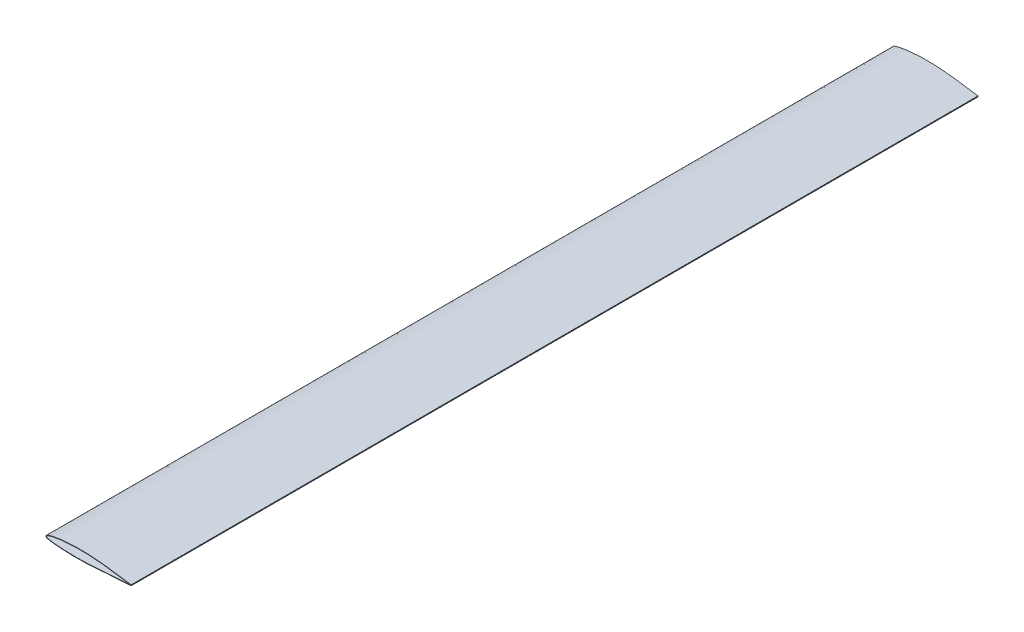
ISO-10303-21;
HEADER;
FILE_DESCRIPTION(('STEP AP214'),'2;1');
FILE_NAME('part.step','',(''),(''),'','','');
FILE_SCHEMA(('AUTOMOTIVE_DESIGN { 1 0 10303 214 1 1 1 1 }'));
ENDSEC;
DATA;
#1=APPLICATION_CONTEXT('core data for automotive mechanical design processes');
#2=APPLICATION_PROTOCOL_DEFINITION('international standard','automotive_design',2000,#1);
#3=PRODUCT_CONTEXT('',#1,'mechanical');
#4=PRODUCT('Part','Part','',(#3));
#5=PRODUCT_RELATED_PRODUCT_CATEGORY('part','',(#4));
#6=PRODUCT_DEFINITION_FORMATION('','',#4);
#7=PRODUCT_DEFINITION_CONTEXT('part definition',#1,'design');
#8=PRODUCT_DEFINITION('design','',#6,#7);
#9=PRODUCT_DEFINITION_SHAPE('','',#8);
#10=(LENGTH_UNIT() NAMED_UNIT(*) SI_UNIT(.MILLI.,.METRE.));
#11=(NAMED_UNIT(*) PLANE_ANGLE_UNIT() SI_UNIT($,.RADIAN.));
#12=(NAMED_UNIT(*) SI_UNIT($,.STERADIAN.) SOLID_ANGLE_UNIT());
#13=UNCERTAINTY_MEASURE_WITH_UNIT(LENGTH_MEASURE(1.E-05),#10,'distance_accuracy_value','');
#14=(GEOMETRIC_REPRESENTATION_CONTEXT(3) GLOBAL_UNCERTAINTY_ASSIGNED_CONTEXT((#13)) GLOBAL_UNIT_ASSIGNED_CONTEXT((#10,
#11,#12)) REPRESENTATION_CONTEXT('',''));
#15=CARTESIAN_POINT('',(0.,0.,0.));
#16=DIRECTION('',(0.,0.,1.));
#17=DIRECTION('',(1.,0.,0.));
#18=AXIS2_PLACEMENT_3D('',#15,#16,#17);
#19=CARTESIAN_POINT('',(2001.51532610475,10.3045225881818,20000.));
#20=CARTESIAN_POINT('',(1980.68493953394,13.4978815249531,20000.));
#21=CARTESIAN_POINT('',(1949.44122769335,18.2876339191739,20000.));
#22=CARTESIAN_POINT('',(1918.20299921555,23.0946734630963,20000.));
#23=CARTESIAN_POINT('',(1897.37902990891,26.3051758829924,20000.));
#24=CARTESIAN_POINT('',(1886.9673263735,27.914015753059,20000.));
#25=CARTESIAN_POINT('',(1855.72733629627,32.7415564034172,20000.));
#26=CARTESIAN_POINT('',(1834.8957304358,35.9604925125355,20000.));
#27=CARTESIAN_POINT('',(1803.63385341161,40.742985964666,20000.));
#28=CARTESIAN_POINT('',(1793.21049611926,42.3284162430746,20000.));
#29=CARTESIAN_POINT('',(1772.36531272727,45.4834240329847,20000.));
#30=CARTESIAN_POINT('',(1751.52028583215,48.6241055351189,20000.));
#31=CARTESIAN_POINT('',(1730.67767334457,51.7506037528209,20000.));
#32=CARTESIAN_POINT('',(1709.83731798834,54.8772402324528,20000.));
#33=CARTESIAN_POINT('',(1699.41983613792,56.4420174827869,20000.));
#34=CARTESIAN_POINT('',(1668.15421968129,61.1364281267247,20000.));
#35=CARTESIAN_POINT('',(1647.29523240685,64.257769053587,20000.));
#36=CARTESIAN_POINT('',(1615.96565889917,68.7974754762002,20000.));
#37=CARTESIAN_POINT('',(1605.51384785611,70.286430270677,20000.));
#38=CARTESIAN_POINT('',(1584.60263187074,73.1976590695309,20000.));
#39=CARTESIAN_POINT('',(1574.14455728518,74.622160008265,20000.));
#40=CARTESIAN_POINT('',(1542.76569437496,78.8201789321044,20000.));
#41=CARTESIAN_POINT('',(1521.84083490686,81.5181942833369,20000.));
#42=CARTESIAN_POINT('',(1479.99112654353,86.8081332180795,20000.));
#43=CARTESIAN_POINT('',(1459.05573467833,89.3996018331019,20000.));
#44=CARTESIAN_POINT('',(1417.15842822003,94.4256851934779,20000.));
#45=CARTESIAN_POINT('',(1396.19478286264,96.8575758760806,20000.));
#46=CARTESIAN_POINT('',(1354.24783687956,101.529266739438,20000.));
#47=CARTESIAN_POINT('',(1333.26437145706,103.772971351125,20000.));
#48=CARTESIAN_POINT('',(1291.27979946758,108.080875931212,20000.));
#49=CARTESIAN_POINT('',(1270.27802048529,110.146585463907,20000.));
#50=CARTESIAN_POINT('',(1207.23933269545,116.05222747816,20000.));
#51=CARTESIAN_POINT('',(1165.17006510799,119.597491474263,20000.));
#52=CARTESIAN_POINT('',(1080.95279123056,125.761490407663,20000.));
#53=CARTESIAN_POINT('',(1038.80377219544,128.385515816948,20000.));
#54=CARTESIAN_POINT('',(975.525018029598,131.487315279104,20000.));
#55=CARTESIAN_POINT('',(954.422452432324,132.381749304307,20000.));
#56=CARTESIAN_POINT('',(912.200621784031,133.856847350967,20000.));
#57=CARTESIAN_POINT('',(891.081648432541,134.438942769075,20000.));
#58=CARTESIAN_POINT('',(848.826316253626,135.246338933748,20000.));
#59=CARTESIAN_POINT('',(827.690647929279,135.470002685622,20000.));
#60=CARTESIAN_POINT('',(785.410062144907,135.497724592581,20000.));
#61=CARTESIAN_POINT('',(764.27100972784,135.295831912138,20000.));
#62=CARTESIAN_POINT('',(722.013893782876,134.526052749033,20000.));
#63=CARTESIAN_POINT('',(700.895703122682,133.961152156519,20000.));
#64=CARTESIAN_POINT('',(658.671757587298,132.526667465867,20000.));
#65=CARTESIAN_POINT('',(637.565428377157,131.651926090623,20000.));
#66=CARTESIAN_POINT('',(574.269602292305,128.555478389686,20000.));
#67=CARTESIAN_POINT('',(532.103125523991,125.865025293977,20000.));
#68=CARTESIAN_POINT('',(468.921115795082,120.849722133069,20000.));
#69=CARTESIAN_POINT('',(447.869685996185,119.012320259405,20000.));
#70=CARTESIAN_POINT('',(405.796218836086,114.959272836863,20000.));
#71=CARTESIAN_POINT('',(384.77394639266,112.742664261642,20000.));
#72=CARTESIAN_POINT('',(342.772461280857,107.89026477866,20000.));
#73=CARTESIAN_POINT('',(321.792929524549,105.255300049071,20000.));
#74=CARTESIAN_POINT('',(279.886976792312,99.5351760470048,20000.));
#75=CARTESIAN_POINT('',(258.950431691582,96.4538515632745,20000.));
#76=CARTESIAN_POINT('',(217.148071042828,89.660347140306,20000.));
#77=CARTESIAN_POINT('',(196.282431941437,85.9466102667113,20000.));
#78=CARTESIAN_POINT('',(165.082975035765,79.765138053068,20000.));
#79=CARTESIAN_POINT('',(154.70086178295,77.603689499628,20000.));
#80=CARTESIAN_POINT('',(133.976443729371,73.0581857745765,20000.));
#81=CARTESIAN_POINT('',(123.62206808447,70.6702478509275,20000.));
#82=CARTESIAN_POINT('',(108.123245531903,66.8332588201902,20000.));
#83=CARTESIAN_POINT('',(102.962432796152,65.511741043564,20000.));
#84=CARTESIAN_POINT('',(92.6553035835602,62.7698609309555,20000.));
#85=CARTESIAN_POINT('',(87.5058154219349,61.3501425468367,20000.));
#86=CARTESIAN_POINT('',(72.0738595945467,56.8909798073648,20000.));
#87=CARTESIAN_POINT('',(61.8157997522479,53.6525191991726,20000.));
#88=CARTESIAN_POINT('',(49.1155669486103,49.0974950167608,20000.));
#89=CARTESIAN_POINT('',(46.5821089669436,48.1613049951805,20000.));
#90=CARTESIAN_POINT('',(41.5278265434441,46.2330627590797,20000.));
#91=CARTESIAN_POINT('',(38.9936722060659,45.2357617041857,20000.));
#92=CARTESIAN_POINT('',(31.3907806220379,42.1012982481726,20000.));
#93=CARTESIAN_POINT('',(26.3208204358396,39.8218030851894,20000.));
#94=CARTESIAN_POINT('',(20.0586818754113,36.5858778268073,20000.));
#95=CARTESIAN_POINT('',(18.8107114337705,35.9197416288892,20000.));
#96=CARTESIAN_POINT('',(16.3215794430235,34.5431436651247,20000.));
#97=CARTESIAN_POINT('',(15.0799020722828,33.8322060029232,20000.));
#98=CARTESIAN_POINT('',(12.6115738188255,32.3614071157317,20000.));
#99=CARTESIAN_POINT('',(11.3849183766263,31.6015492416052,20000.));
#100=CARTESIAN_POINT('',(9.56317002484203,30.4219067056616,20000.));
#101=CARTESIAN_POINT('',(8.95896046780812,30.0220450687929,20000.));
#102=CARTESIAN_POINT('',(8.058090480664,29.4118388167201,20000.));
#103=CARTESIAN_POINT('',(7.75994869093506,29.2075813208918,20000.));
#104=CARTESIAN_POINT('',(7.15977646376483,28.7913693456616,20000.));
#105=CARTESIAN_POINT('',(6.85588197075561,28.5780220081686,20000.));
#106=CARTESIAN_POINT('',(5.31890891762688,27.4807605219888,20000.));
#107=CARTESIAN_POINT('',(4.03098832242353,26.5040143109438,20000.));
#108=CARTESIAN_POINT('',(2.07135491146526,24.8183722975245,20000.));
#109=CARTESIAN_POINT('',(1.41141671894823,24.2165665096561,20000.));
#110=CARTESIAN_POINT('',(0.124513508041677,22.9640341344804,20000.));
#111=CARTESIAN_POINT('',(-0.50619603103645,22.3110980723185,20000.));
#112=CARTESIAN_POINT('',(-2.35223929469443,20.2727010749271,20000.));
#113=CARTESIAN_POINT('',(-3.5223848011734,18.808418605997,20000.));
#114=CARTESIAN_POINT('',(-5.67797943523934,15.6571167122524,20000.));
#115=CARTESIAN_POINT('',(-6.66444605897573,13.9702056500003,20000.));
#116=CARTESIAN_POINT('',(-7.92792437936347,11.2439238699316,20000.));
#117=CARTESIAN_POINT('',(-8.31263485169437,10.3022415410215,20000.));
#118=CARTESIAN_POINT('',(-8.98822009238381,8.3470231664018,20000.));
#119=CARTESIAN_POINT('',(-9.27915368062427,7.33331611183203,20000.));
#120=CARTESIAN_POINT('',(-9.73848072132057,5.23084139649043,20000.));
#121=CARTESIAN_POINT('',(-9.90681372382366,4.14178040274182,20000.));
#122=CARTESIAN_POINT('',(-10.0838579520322,1.89529575440687,20000.));
#123=CARTESIAN_POINT('',(-10.09223518977,0.737579707889871,20000.));
#124=CARTESIAN_POINT('',(-9.97787198438215,-0.73597280509779,20000.));
#125=CARTESIAN_POINT('',(-9.94861057223567,-1.03306949895871,20000.));
#126=CARTESIAN_POINT('',(-9.87793573906888,-1.6228606227075,20000.));
#127=CARTESIAN_POINT('',(-9.83664130487994,-1.91527179516748,20000.));
#128=CARTESIAN_POINT('',(-9.69592410376717,-2.78432868510665,20000.));
#129=CARTESIAN_POINT('',(-9.57966860919077,-3.35274833861247,20000.));
#130=CARTESIAN_POINT('',(-9.17209873168616,-5.02122131834309,20000.));
#131=CARTESIAN_POINT('',(-8.82227586196151,-6.08395694818749,20000.));
#132=CARTESIAN_POINT('',(-8.00846306936775,-8.10553667414571,20000.));
#133=CARTESIAN_POINT('',(-7.54455642163185,-9.06473784592262,20000.));
#134=CARTESIAN_POINT('',(-6.5349515451829,-10.887582896722,20000.));
#135=CARTESIAN_POINT('',(-5.98917445338665,-11.7514439360103,20000.));
#136=CARTESIAN_POINT('',(-4.26291679855344,-14.2172113877868,20000.));
#137=CARTESIAN_POINT('',(-2.99519331074599,-15.6948045369837,20000.));
#138=CARTESIAN_POINT('',(-0.336884752614994,-18.3915784327982,20000.));
#139=CARTESIAN_POINT('',(1.0550928124892,-19.6105513288497,20000.));
#140=CARTESIAN_POINT('',(3.18368300533729,-21.2726467376236,20000.));
#141=CARTESIAN_POINT('',(3.90015529314124,-21.7986893443778,20000.));
#142=CARTESIAN_POINT('',(5.33981284935606,-22.7969503592895,20000.));
#143=CARTESIAN_POINT('',(6.06573147513913,-23.2706356577417,20000.));
#144=CARTESIAN_POINT('',(8.22157632872363,-24.5998112411294,20000.));
#145=CARTESIAN_POINT('',(9.62526522163624,-25.3628164967529,20000.));
#146=CARTESIAN_POINT('',(11.3111971737697,-26.2156197257257,20000.));
#147=CARTESIAN_POINT('',(11.6450576162079,-26.3811921541468,20000.));
#148=CARTESIAN_POINT('',(12.3059420580181,-26.7038622972426,20000.));
#149=CARTESIAN_POINT('',(12.6326193842898,-26.8608849955386,20000.));
#150=CARTESIAN_POINT('',(13.617955640403,-27.3280106418199,20000.));
#151=CARTESIAN_POINT('',(14.2767557413562,-27.6314472132707,20000.));
#152=CARTESIAN_POINT('',(16.2570018219769,-28.5195977032063,20000.));
#153=CARTESIAN_POINT('',(17.5822944382137,-29.0821819740311,20000.));
#154=CARTESIAN_POINT('',(20.2331960792433,-30.1570625083207,20000.));
#155=CARTESIAN_POINT('',(21.5588131140164,-30.6693536071775,20000.));
#156=CARTESIAN_POINT('',(24.2003230816388,-31.6514990383317,20000.));
#157=CARTESIAN_POINT('',(25.5187397783914,-32.1226506903293,20000.));
#158=CARTESIAN_POINT('',(32.1208148152877,-34.3978125776941,20000.));
#159=CARTESIAN_POINT('',(37.4098213158365,-35.9503897969538,20000.));
#160=CARTESIAN_POINT('',(45.304077802702,-38.0433269305494,20000.));
#161=CARTESIAN_POINT('',(47.9272200026346,-38.7012018181776,20000.));
#162=CARTESIAN_POINT('',(53.1614162943925,-39.9663294534609,20000.));
#163=CARTESIAN_POINT('',(55.7815107251759,-40.5749499509534,20000.));
#164=CARTESIAN_POINT('',(63.6484861282753,-42.3359075804973,20000.));
#165=CARTESIAN_POINT('',(68.9020497692088,-43.4233546860677,20000.));
#166=CARTESIAN_POINT('',(79.4150531260712,-45.4618321456735,20000.));
#167=CARTESIAN_POINT('',(84.6744987685123,-46.4128636622965,20000.));
#168=CARTESIAN_POINT('',(95.1875597002779,-48.2146911584615,20000.));
#169=CARTESIAN_POINT('',(100.438117868675,-49.065867052824,20000.));
#170=CARTESIAN_POINT('',(116.189150385686,-51.5203444109326,20000.));
#171=CARTESIAN_POINT('',(126.694304539762,-53.0173427121477,20000.));
#172=CARTESIAN_POINT('',(147.705794144928,-55.8113919993721,20000.));
#173=CARTESIAN_POINT('',(158.210310951106,-57.1121737890731,20000.));
#174=CARTESIAN_POINT('',(189.750107715011,-60.7980816064959,20000.));
#175=CARTESIAN_POINT('',(210.799649552929,-62.9530566393929,20000.));
#176=CARTESIAN_POINT('',(252.913014447896,-66.8152167596864,20000.));
#177=CARTESIAN_POINT('',(273.978392024617,-68.5217791111319,20000.));
#178=CARTESIAN_POINT('',(316.106614567756,-71.636971230092,20000.));
#179=CARTESIAN_POINT('',(337.175452839567,-73.0520259097315,20000.));
#180=CARTESIAN_POINT('',(379.331211043362,-75.6134053988037,20000.));
#181=CARTESIAN_POINT('',(400.41697791997,-76.7579959399292,20000.));
#182=CARTESIAN_POINT('',(442.595082859352,-78.7919908035613,20000.));
#183=CARTESIAN_POINT('',(463.687261014038,-79.6834097938268,20000.));
#184=CARTESIAN_POINT('',(505.873534296069,-81.2533896301831,20000.));
#185=CARTESIAN_POINT('',(526.96796293006,-81.9351646331023,20000.));
#186=CARTESIAN_POINT('',(569.165415178501,-83.0940741336446,20000.));
#187=CARTESIAN_POINT('',(590.267594236587,-83.5698940632231,20000.));
#188=CARTESIAN_POINT('',(632.475658602395,-84.3086651424921,20000.));
#189=CARTESIAN_POINT('',(653.581146205809,-84.5722402737262,20000.));
#190=CARTESIAN_POINT('',(685.240249212031,-84.8126600546646,20000.));
#191=CARTESIAN_POINT('',(695.793040165368,-84.8670851767496,20000.));
#192=CARTESIAN_POINT('',(716.900496014951,-84.924439081966,20000.));
#193=CARTESIAN_POINT('',(727.455844607978,-84.9267932778174,20000.));
#194=CARTESIAN_POINT('',(759.126005797906,-84.8405110313745,20000.));
#195=CARTESIAN_POINT('',(780.2450338636,-84.6585307192497,20000.));
#196=CARTESIAN_POINT('',(822.489670945776,-83.9688977742842,20000.));
#197=CARTESIAN_POINT('',(843.605109580113,-83.4617225275626,20000.));
#198=CARTESIAN_POINT('',(906.926479153595,-81.5359492513517,20000.));
#199=CARTESIAN_POINT('',(949.105966758767,-79.7199685903322,20000.));
#200=CARTESIAN_POINT('',(1033.40210625447,-75.3889990665384,20000.));
#201=CARTESIAN_POINT('',(1075.52473335317,-72.8760718642254,20000.));
#202=CARTESIAN_POINT('',(1138.67061041073,-68.7087525716309,20000.));
#203=CARTESIAN_POINT('',(1159.71222164288,-67.2547711125376,20000.));
#204=CARTESIAN_POINT('',(1201.7831843325,-64.2513453558825,20000.));
#205=CARTESIAN_POINT('',(1222.81265818422,-62.703176490424,20000.));
#206=CARTESIAN_POINT('',(1264.8643362659,-59.5344851890555,20000.));
#207=CARTESIAN_POINT('',(1285.88624809253,-57.9133409113974,20000.));
#208=CARTESIAN_POINT('',(1327.92214141425,-54.6148720201538,20000.));
#209=CARTESIAN_POINT('',(1348.93556149462,-52.9381628339574,20000.));
#210=CARTESIAN_POINT('',(1411.96555281834,-47.8703810220994,20000.));
#211=CARTESIAN_POINT('',(1453.97085603869,-44.4386796030374,20000.));
#212=CARTESIAN_POINT('',(1516.97287114622,-39.4186950260142,20000.));
#213=CARTESIAN_POINT('',(1537.9664907338,-37.7648632739377,20000.));
#214=CARTESIAN_POINT('',(1569.44883516263,-35.4134093087472,20000.));
#215=CARTESIAN_POINT('',(1579.94180599448,-34.6511582696314,20000.));
#216=CARTESIAN_POINT('',(1600.92650362521,-33.1864910326707,20000.));
#217=CARTESIAN_POINT('',(1611.41910634612,-32.4866491284862,20000.));
#218=CARTESIAN_POINT('',(1642.91707256956,-30.4640889371418,20000.));
#219=CARTESIAN_POINT('',(1663.93486455329,-29.2148400466198,20000.));
#220=CARTESIAN_POINT('',(1695.48200694379,-27.3721383664385,20000.));
#221=CARTESIAN_POINT('',(1706.00170331676,-26.761503955219,20000.));
#222=CARTESIAN_POINT('',(1727.03793092301,-25.5415508156617,20000.));
#223=CARTESIAN_POINT('',(1737.55560844989,-24.9334290313203,20000.));
#224=CARTESIAN_POINT('',(1769.10766864464,-23.1192604331534,20000.));
#225=CARTESIAN_POINT('',(1790.1399308093,-21.9242667145639,20000.));
#226=CARTESIAN_POINT('',(1832.20914491793,-19.582334736305,20000.));
#227=CARTESIAN_POINT('',(1853.24750242906,-18.4318239999721,20000.));
#228=CARTESIAN_POINT('',(1895.32980404983,-16.1396778380324,20000.));
#229=CARTESIAN_POINT('',(1916.37395989304,-14.9955538512002,20000.));
#230=CARTESIAN_POINT('',(1958.45978062453,-12.701563874393,20000.));
#231=CARTESIAN_POINT('',(1979.50241287275,-11.5533495566702,20000.));
#232=CARTESIAN_POINT('',(2000.5448504378,-10.4051458677593,20000.));
#233=B_SPLINE_CURVE_WITH_KNOTS('',3,(#19,#20,#21,#22,#23,#24,#25,#26,#27,#28,#29,#30,#31,#32,
#33,#34,#35,#36,#37,#38,#39,#40,#41,#42,#43,#44,#45,#46,#47,#48,#49,#50,#51,#52,#53,#54,#55,#56,
#57,#58,#59,#60,#61,#62,#63,#64,#65,#66,#67,#68,#69,#70,#71,#72,#73,#74,#75,#76,#77,#78,#79,#80,
#81,#82,#83,#84,#85,#86,#87,#88,#89,#90,#91,#92,#93,#94,#95,#96,#97,#98,#99,#100,#101,#102,#103,
#104,#105,#106,#107,#108,#109,#110,#111,#112,#113,#114,#115,#116,#117,#118,#119,#120,#121,#122,
#123,#124,#125,#126,#127,#128,#129,#130,#131,#132,#133,#134,#135,#136,#137,#138,#139,#140,#141,
#142,#143,#144,#145,#146,#147,#148,#149,#150,#151,#152,#153,#154,#155,#156,#157,#158,#159,#160,
#161,#162,#163,#164,#165,#166,#167,#168,#169,#170,#171,#172,#173,#174,#175,#176,#177,#178,#179,
#180,#181,#182,#183,#184,#185,#186,#187,#188,#189,#190,#191,#192,#193,#194,#195,#196,#197,#198,
#199,#200,#201,#202,#203,#204,#205,#206,#207,#208,#209,#210,#211,#212,#213,#214,#215,#216,#217,
#218,#219,#220,#221,#222,#223,#224,#225,#226,#227,#228,#229,#230,#231,#232),.UNSPECIFIED.,.F.,
.F.,(4,1,2,2,2,2,1,2,2,2,2,2,2,2,2,2,2,2,2,2,2,2,2,2,2,2,2,2,2,2,2,2,2,2,2,2,2,2,2,2,2,2,2,2,2,
2,2,2,2,2,2,2,2,2,2,2,2,2,2,2,2,2,2,2,2,2,2,2,2,2,2,2,2,2,2,2,2,2,2,2,2,2,2,2,2,2,2,2,2,2,2,2,2,
2,2,2,2,2,2,2,2,2,2,2,2,2,2,4),(0.,0.015625,0.0234375,0.0312500000000001,0.0468750000000001,
0.0546875000000002,0.0625000000000003,0.0703125000000004,0.0781250000000005,0.0937500000000007,
0.101562500000001,0.109375000000001,0.125000000000001,0.140625000000001,0.156250000000002,
0.171875000000002,0.187500000000002,0.218750000000002,0.250000000000003,0.265625000000003,
0.281250000000003,0.296875000000003,0.312500000000003,0.328125000000003,0.343750000000004,
0.375000000000004,0.390625000000004,0.406250000000004,0.421875000000004,0.437500000000004,
0.453125000000004,0.460937500000004,0.468750000000004,0.472656250000004,0.476562500000004,
0.484375000000004,0.486328125000004,0.488281250000004,0.492187500000004,0.493164062500004,
0.494140625000004,0.495117187500004,0.495605468750004,0.495849609375004,0.496093750000004,
0.497070312500004,0.497558593750004,0.498046875000004,0.499023437500004,0.500000000000004,
0.500488281250004,0.500976562500004,0.501464843750004,0.501953125000004,0.502075195312504,
0.502197265625004,0.502441406250004,0.502929687500004,0.503417968750004,0.503906250000004,
0.504882812500004,0.505859375000004,0.506347656250004,0.506835937500004,0.507812500000004,
0.508056640625004,0.508300781250004,0.508789062500004,0.509765625000004,0.510742187500004,
0.511718750000004,0.515625000000004,0.517578125000004,0.519531250000004,0.523437500000004,
0.527343750000004,0.531250000000004,0.539062500000004,0.546875000000004,0.562500000000004,
0.578125000000004,0.593750000000005,0.609375000000005,0.625000000000005,0.640625000000005,
0.656250000000005,0.671875000000005,0.679687500000005,0.687500000000005,0.703125000000005,
0.718750000000005,0.750000000000004,0.781250000000004,0.796875000000004,0.812500000000004,
0.828125000000004,0.843750000000004,0.875000000000003,0.890625000000003,0.898437500000003,
0.906250000000003,0.921875000000002,0.929687500000002,0.937500000000002,0.953125000000001,
0.968750000000001,0.984375,1.),.UNSPECIFIED.);
#234=DIRECTION('',(0.,0.,-1.));
#235=VECTOR('',#234,1.);
#236=SURFACE_OF_LINEAR_EXTRUSION('',#233,#235);
#237=CARTESIAN_POINT('',(2001.51532610475,10.3045225881818,0.));
#238=CARTESIAN_POINT('',(1980.68493953394,13.4978815249531,0.));
#239=CARTESIAN_POINT('',(1949.44122769335,18.2876339191739,0.));
#240=CARTESIAN_POINT('',(1918.20299921555,23.0946734630963,0.));
#241=CARTESIAN_POINT('',(1897.37902990891,26.3051758829924,0.));
#242=CARTESIAN_POINT('',(1886.9673263735,27.914015753059,0.));
#243=CARTESIAN_POINT('',(1855.72733629627,32.7415564034172,0.));
#244=CARTESIAN_POINT('',(1834.8957304358,35.9604925125355,0.));
#245=CARTESIAN_POINT('',(1803.63385341161,40.742985964666,0.));
#246=CARTESIAN_POINT('',(1793.21049611926,42.3284162430746,0.));
#247=CARTESIAN_POINT('',(1772.36531272727,45.4834240329847,0.));
#248=CARTESIAN_POINT('',(1751.52028583215,48.6241055351189,0.));
#249=CARTESIAN_POINT('',(1730.67767334457,51.7506037528209,0.));
#250=CARTESIAN_POINT('',(1709.83731798834,54.8772402324528,0.));
#251=CARTESIAN_POINT('',(1699.41983613792,56.4420174827869,0.));
#252=CARTESIAN_POINT('',(1668.15421968129,61.1364281267247,0.));
#253=CARTESIAN_POINT('',(1647.29523240685,64.257769053587,0.));
#254=CARTESIAN_POINT('',(1615.96565889917,68.7974754762002,0.));
#255=CARTESIAN_POINT('',(1605.51384785611,70.286430270677,0.));
#256=CARTESIAN_POINT('',(1584.60263187074,73.1976590695309,0.));
#257=CARTESIAN_POINT('',(1574.14455728518,74.622160008265,0.));
#258=CARTESIAN_POINT('',(1542.76569437496,78.8201789321044,0.));
#259=CARTESIAN_POINT('',(1521.84083490686,81.5181942833369,0.));
#260=CARTESIAN_POINT('',(1479.99112654353,86.8081332180795,0.));
#261=CARTESIAN_POINT('',(1459.05573467833,89.3996018331019,0.));
#262=CARTESIAN_POINT('',(1417.15842822003,94.4256851934779,0.));
#263=CARTESIAN_POINT('',(1396.19478286264,96.8575758760806,0.));
#264=CARTESIAN_POINT('',(1354.24783687956,101.529266739438,0.));
#265=CARTESIAN_POINT('',(1333.26437145706,103.772971351125,0.));
#266=CARTESIAN_POINT('',(1291.27979946758,108.080875931212,0.));
#267=CARTESIAN_POINT('',(1270.27802048529,110.146585463907,0.));
#268=CARTESIAN_POINT('',(1207.23933269545,116.05222747816,0.));
#269=CARTESIAN_POINT('',(1165.17006510799,119.597491474263,0.));
#270=CARTESIAN_POINT('',(1080.95279123056,125.761490407663,0.));
#271=CARTESIAN_POINT('',(1038.80377219544,128.385515816948,0.));
#272=CARTESIAN_POINT('',(975.525018029598,131.487315279104,0.));
#273=CARTESIAN_POINT('',(954.422452432324,132.381749304307,0.));
#274=CARTESIAN_POINT('',(912.200621784031,133.856847350967,0.));
#275=CARTESIAN_POINT('',(891.081648432541,134.438942769075,0.));
#276=CARTESIAN_POINT('',(848.826316253626,135.246338933748,0.));
#277=CARTESIAN_POINT('',(827.690647929279,135.470002685622,0.));
#278=CARTESIAN_POINT('',(785.410062144907,135.497724592581,0.));
#279=CARTESIAN_POINT('',(764.27100972784,135.295831912138,0.));
#280=CARTESIAN_POINT('',(722.013893782876,134.526052749033,0.));
#281=CARTESIAN_POINT('',(700.895703122682,133.961152156519,0.));
#282=CARTESIAN_POINT('',(658.671757587298,132.526667465867,0.));
#283=CARTESIAN_POINT('',(637.565428377157,131.651926090623,0.));
#284=CARTESIAN_POINT('',(574.269602292305,128.555478389686,0.));
#285=CARTESIAN_POINT('',(532.103125523991,125.865025293977,0.));
#286=CARTESIAN_POINT('',(468.921115795082,120.849722133069,0.));
#287=CARTESIAN_POINT('',(447.869685996185,119.012320259405,0.));
#288=CARTESIAN_POINT('',(405.796218836086,114.959272836863,0.));
#289=CARTESIAN_POINT('',(384.77394639266,112.742664261642,0.));
#290=CARTESIAN_POINT('',(342.772461280857,107.89026477866,0.));
#291=CARTESIAN_POINT('',(321.792929524549,105.255300049071,0.));
#292=CARTESIAN_POINT('',(279.886976792312,99.5351760470048,0.));
#293=CARTESIAN_POINT('',(258.950431691582,96.4538515632745,0.));
#294=CARTESIAN_POINT('',(217.148071042828,89.660347140306,0.));
#295=CARTESIAN_POINT('',(196.282431941437,85.9466102667113,0.));
#296=CARTESIAN_POINT('',(165.082975035765,79.765138053068,0.));
#297=CARTESIAN_POINT('',(154.70086178295,77.603689499628,0.));
#298=CARTESIAN_POINT('',(133.976443729371,73.0581857745765,0.));
#299=CARTESIAN_POINT('',(123.62206808447,70.6702478509275,0.));
#300=CARTESIAN_POINT('',(108.123245531903,66.8332588201902,0.));
#301=CARTESIAN_POINT('',(102.962432796152,65.511741043564,0.));
#302=CARTESIAN_POINT('',(92.6553035835602,62.7698609309555,0.));
#303=CARTESIAN_POINT('',(87.5058154219349,61.3501425468367,0.));
#304=CARTESIAN_POINT('',(72.0738595945467,56.8909798073648,0.));
#305=CARTESIAN_POINT('',(61.8157997522479,53.6525191991726,0.));
#306=CARTESIAN_POINT('',(49.1155669486103,49.0974950167608,0.));
#307=CARTESIAN_POINT('',(46.5821089669436,48.1613049951805,0.));
#308=CARTESIAN_POINT('',(41.5278265434441,46.2330627590797,0.));
#309=CARTESIAN_POINT('',(38.9936722060659,45.2357617041857,0.));
#310=CARTESIAN_POINT('',(31.3907806220379,42.1012982481726,0.));
#311=CARTESIAN_POINT('',(26.3208204358396,39.8218030851894,0.));
#312=CARTESIAN_POINT('',(20.0586818754113,36.5858778268073,0.));
#313=CARTESIAN_POINT('',(18.8107114337705,35.9197416288892,0.));
#314=CARTESIAN_POINT('',(16.3215794430235,34.5431436651247,0.));
#315=CARTESIAN_POINT('',(15.0799020722828,33.8322060029232,0.));
#316=CARTESIAN_POINT('',(12.6115738188255,32.3614071157317,0.));
#317=CARTESIAN_POINT('',(11.3849183766263,31.6015492416052,0.));
#318=CARTESIAN_POINT('',(9.56317002484203,30.4219067056616,0.));
#319=CARTESIAN_POINT('',(8.95896046780812,30.0220450687929,0.));
#320=CARTESIAN_POINT('',(8.058090480664,29.4118388167201,0.));
#321=CARTESIAN_POINT('',(7.75994869093506,29.2075813208918,0.));
#322=CARTESIAN_POINT('',(7.15977646376483,28.7913693456616,0.));
#323=CARTESIAN_POINT('',(6.85588197075561,28.5780220081686,0.));
#324=CARTESIAN_POINT('',(5.31890891762688,27.4807605219888,0.));
#325=CARTESIAN_POINT('',(4.03098832242353,26.5040143109438,0.));
#326=CARTESIAN_POINT('',(2.07135491146526,24.8183722975245,0.));
#327=CARTESIAN_POINT('',(1.41141671894823,24.2165665096561,0.));
#328=CARTESIAN_POINT('',(0.124513508041677,22.9640341344804,0.));
#329=CARTESIAN_POINT('',(-0.50619603103645,22.3110980723185,0.));
#330=CARTESIAN_POINT('',(-2.35223929469443,20.2727010749271,0.));
#331=CARTESIAN_POINT('',(-3.5223848011734,18.808418605997,0.));
#332=CARTESIAN_POINT('',(-5.67797943523934,15.6571167122524,0.));
#333=CARTESIAN_POINT('',(-6.66444605897573,13.9702056500003,0.));
#334=CARTESIAN_POINT('',(-7.92792437936347,11.2439238699316,0.));
#335=CARTESIAN_POINT('',(-8.31263485169437,10.3022415410215,0.));
#336=CARTESIAN_POINT('',(-8.98822009238381,8.3470231664018,0.));
#337=CARTESIAN_POINT('',(-9.27915368062427,7.33331611183203,0.));
#338=CARTESIAN_POINT('',(-9.73848072132057,5.23084139649043,0.));
#339=CARTESIAN_POINT('',(-9.90681372382366,4.14178040274182,0.));
#340=CARTESIAN_POINT('',(-10.0838579520322,1.89529575440687,0.));
#341=CARTESIAN_POINT('',(-10.09223518977,0.737579707889871,0.));
#342=CARTESIAN_POINT('',(-9.97787198438215,-0.73597280509779,0.));
#343=CARTESIAN_POINT('',(-9.94861057223567,-1.03306949895871,0.));
#344=CARTESIAN_POINT('',(-9.87793573906888,-1.6228606227075,0.));
#345=CARTESIAN_POINT('',(-9.83664130487994,-1.91527179516748,0.));
#346=CARTESIAN_POINT('',(-9.69592410376717,-2.78432868510665,0.));
#347=CARTESIAN_POINT('',(-9.57966860919077,-3.35274833861247,0.));
#348=CARTESIAN_POINT('',(-9.17209873168616,-5.02122131834309,0.));
#349=CARTESIAN_POINT('',(-8.82227586196151,-6.08395694818749,0.));
#350=CARTESIAN_POINT('',(-8.00846306936775,-8.10553667414571,0.));
#351=CARTESIAN_POINT('',(-7.54455642163185,-9.06473784592262,0.));
#352=CARTESIAN_POINT('',(-6.5349515451829,-10.887582896722,0.));
#353=CARTESIAN_POINT('',(-5.98917445338665,-11.7514439360103,0.));
#354=CARTESIAN_POINT('',(-4.26291679855344,-14.2172113877868,0.));
#355=CARTESIAN_POINT('',(-2.99519331074599,-15.6948045369837,0.));
#356=CARTESIAN_POINT('',(-0.336884752614994,-18.3915784327982,0.));
#357=CARTESIAN_POINT('',(1.0550928124892,-19.6105513288497,0.));
#358=CARTESIAN_POINT('',(3.18368300533729,-21.2726467376236,0.));
#359=CARTESIAN_POINT('',(3.90015529314124,-21.7986893443778,0.));
#360=CARTESIAN_POINT('',(5.33981284935606,-22.7969503592895,0.));
#361=CARTESIAN_POINT('',(6.06573147513913,-23.2706356577417,0.));
#362=CARTESIAN_POINT('',(8.22157632872363,-24.5998112411294,0.));
#363=CARTESIAN_POINT('',(9.62526522163624,-25.3628164967529,0.));
#364=CARTESIAN_POINT('',(11.3111971737697,-26.2156197257257,0.));
#365=CARTESIAN_POINT('',(11.6450576162079,-26.3811921541468,0.));
#366=CARTESIAN_POINT('',(12.3059420580181,-26.7038622972426,0.));
#367=CARTESIAN_POINT('',(12.6326193842898,-26.8608849955386,0.));
#368=CARTESIAN_POINT('',(13.617955640403,-27.3280106418199,0.));
#369=CARTESIAN_POINT('',(14.2767557413562,-27.6314472132707,0.));
#370=CARTESIAN_POINT('',(16.2570018219769,-28.5195977032063,0.));
#371=CARTESIAN_POINT('',(17.5822944382137,-29.0821819740311,0.));
#372=CARTESIAN_POINT('',(20.2331960792433,-30.1570625083207,0.));
#373=CARTESIAN_POINT('',(21.5588131140164,-30.6693536071775,0.));
#374=CARTESIAN_POINT('',(24.2003230816388,-31.6514990383317,0.));
#375=CARTESIAN_POINT('',(25.5187397783914,-32.1226506903293,0.));
#376=CARTESIAN_POINT('',(32.1208148152877,-34.3978125776941,0.));
#377=CARTESIAN_POINT('',(37.4098213158365,-35.9503897969538,0.));
#378=CARTESIAN_POINT('',(45.304077802702,-38.0433269305494,0.));
#379=CARTESIAN_POINT('',(47.9272200026346,-38.7012018181776,0.));
#380=CARTESIAN_POINT('',(53.1614162943925,-39.9663294534609,0.));
#381=CARTESIAN_POINT('',(55.7815107251759,-40.5749499509534,0.));
#382=CARTESIAN_POINT('',(63.6484861282753,-42.3359075804973,0.));
#383=CARTESIAN_POINT('',(68.9020497692088,-43.4233546860677,0.));
#384=CARTESIAN_POINT('',(79.4150531260712,-45.4618321456735,0.));
#385=CARTESIAN_POINT('',(84.6744987685123,-46.4128636622965,0.));
#386=CARTESIAN_POINT('',(95.1875597002779,-48.2146911584615,0.));
#387=CARTESIAN_POINT('',(100.438117868675,-49.065867052824,0.));
#388=CARTESIAN_POINT('',(116.189150385686,-51.5203444109326,0.));
#389=CARTESIAN_POINT('',(126.694304539762,-53.0173427121477,0.));
#390=CARTESIAN_POINT('',(147.705794144928,-55.8113919993721,0.));
#391=CARTESIAN_POINT('',(158.210310951106,-57.1121737890731,0.));
#392=CARTESIAN_POINT('',(189.750107715011,-60.7980816064959,0.));
#393=CARTESIAN_POINT('',(210.799649552929,-62.9530566393929,0.));
#394=CARTESIAN_POINT('',(252.913014447896,-66.8152167596864,0.));
#395=CARTESIAN_POINT('',(273.978392024617,-68.5217791111319,0.));
#396=CARTESIAN_POINT('',(316.106614567756,-71.636971230092,0.));
#397=CARTESIAN_POINT('',(337.175452839567,-73.0520259097315,0.));
#398=CARTESIAN_POINT('',(379.331211043362,-75.6134053988037,0.));
#399=CARTESIAN_POINT('',(400.41697791997,-76.7579959399292,0.));
#400=CARTESIAN_POINT('',(442.595082859352,-78.7919908035613,0.));
#401=CARTESIAN_POINT('',(463.687261014038,-79.6834097938268,0.));
#402=CARTESIAN_POINT('',(505.873534296069,-81.2533896301831,0.));
#403=CARTESIAN_POINT('',(526.96796293006,-81.9351646331023,0.));
#404=CARTESIAN_POINT('',(569.165415178501,-83.0940741336446,0.));
#405=CARTESIAN_POINT('',(590.267594236587,-83.5698940632231,0.));
#406=CARTESIAN_POINT('',(632.475658602395,-84.3086651424921,0.));
#407=CARTESIAN_POINT('',(653.581146205809,-84.5722402737262,0.));
#408=CARTESIAN_POINT('',(685.240249212031,-84.8126600546646,0.));
#409=CARTESIAN_POINT('',(695.793040165368,-84.8670851767496,0.));
#410=CARTESIAN_POINT('',(716.900496014951,-84.924439081966,0.));
#411=CARTESIAN_POINT('',(727.455844607978,-84.9267932778174,0.));
#412=CARTESIAN_POINT('',(759.126005797906,-84.8405110313745,0.));
#413=CARTESIAN_POINT('',(780.2450338636,-84.6585307192497,0.));
#414=CARTESIAN_POINT('',(822.489670945776,-83.9688977742842,0.));
#415=CARTESIAN_POINT('',(843.605109580113,-83.4617225275626,0.));
#416=CARTESIAN_POINT('',(906.926479153595,-81.5359492513517,0.));
#417=CARTESIAN_POINT('',(949.105966758767,-79.7199685903322,0.));
#418=CARTESIAN_POINT('',(1033.40210625447,-75.3889990665384,0.));
#419=CARTESIAN_POINT('',(1075.52473335317,-72.8760718642254,0.));
#420=CARTESIAN_POINT('',(1138.67061041073,-68.7087525716309,0.));
#421=CARTESIAN_POINT('',(1159.71222164288,-67.2547711125376,0.));
#422=CARTESIAN_POINT('',(1201.7831843325,-64.2513453558825,0.));
#423=CARTESIAN_POINT('',(1222.81265818422,-62.703176490424,0.));
#424=CARTESIAN_POINT('',(1264.8643362659,-59.5344851890555,0.));
#425=CARTESIAN_POINT('',(1285.88624809253,-57.9133409113974,0.));
#426=CARTESIAN_POINT('',(1327.92214141425,-54.6148720201538,0.));
#427=CARTESIAN_POINT('',(1348.93556149462,-52.9381628339574,0.));
#428=CARTESIAN_POINT('',(1411.96555281834,-47.8703810220994,0.));
#429=CARTESIAN_POINT('',(1453.97085603869,-44.4386796030374,0.));
#430=CARTESIAN_POINT('',(1516.97287114622,-39.4186950260142,0.));
#431=CARTESIAN_POINT('',(1537.9664907338,-37.7648632739377,0.));
#432=CARTESIAN_POINT('',(1569.44883516263,-35.4134093087472,0.));
#433=CARTESIAN_POINT('',(1579.94180599448,-34.6511582696314,0.));
#434=CARTESIAN_POINT('',(1600.92650362521,-33.1864910326707,0.));
#435=CARTESIAN_POINT('',(1611.41910634612,-32.4866491284862,0.));
#436=CARTESIAN_POINT('',(1642.91707256956,-30.4640889371418,0.));
#437=CARTESIAN_POINT('',(1663.93486455329,-29.2148400466198,0.));
#438=CARTESIAN_POINT('',(1695.48200694379,-27.3721383664385,0.));
#439=CARTESIAN_POINT('',(1706.00170331676,-26.761503955219,0.));
#440=CARTESIAN_POINT('',(1727.03793092301,-25.5415508156617,0.));
#441=CARTESIAN_POINT('',(1737.55560844989,-24.9334290313203,0.));
#442=CARTESIAN_POINT('',(1769.10766864464,-23.1192604331534,0.));
#443=CARTESIAN_POINT('',(1790.1399308093,-21.9242667145639,0.));
#444=CARTESIAN_POINT('',(1832.20914491793,-19.582334736305,0.));
#445=CARTESIAN_POINT('',(1853.24750242906,-18.4318239999721,0.));
#446=CARTESIAN_POINT('',(1895.32980404983,-16.1396778380324,0.));
#447=CARTESIAN_POINT('',(1916.37395989304,-14.9955538512002,0.));
#448=CARTESIAN_POINT('',(1958.45978062453,-12.701563874393,0.));
#449=CARTESIAN_POINT('',(1979.50241287275,-11.5533495566702,0.));
#450=CARTESIAN_POINT('',(2000.5448504378,-10.4051458677593,0.));
#451=B_SPLINE_CURVE_WITH_KNOTS('',3,(#237,#238,#239,#240,#241,#242,#243,#244,#245,#246,#247,
#248,#249,#250,#251,#252,#253,#254,#255,#256,#257,#258,#259,#260,#261,#262,#263,#264,#265,#266,
#267,#268,#269,#270,#271,#272,#273,#274,#275,#276,#277,#278,#279,#280,#281,#282,#283,#284,#285,
#286,#287,#288,#289,#290,#291,#292,#293,#294,#295,#296,#297,#298,#299,#300,#301,#302,#303,#304,
#305,#306,#307,#308,#309,#310,#311,#312,#313,#314,#315,#316,#317,#318,#319,#320,#321,#322,#323,
#324,#325,#326,#327,#328,#329,#330,#331,#332,#333,#334,#335,#336,#337,#338,#339,#340,#341,#342,
#343,#344,#345,#346,#347,#348,#349,#350,#351,#352,#353,#354,#355,#356,#357,#358,#359,#360,#361,
#362,#363,#364,#365,#366,#367,#368,#369,#370,#371,#372,#373,#374,#375,#376,#377,#378,#379,#380,
#381,#382,#383,#384,#385,#386,#387,#388,#389,#390,#391,#392,#393,#394,#395,#396,#397,#398,#399,
#400,#401,#402,#403,#404,#405,#406,#407,#408,#409,#410,#411,#412,#413,#414,#415,#416,#417,#418,
#419,#420,#421,#422,#423,#424,#425,#426,#427,#428,#429,#430,#431,#432,#433,#434,#435,#436,#437,
#438,#439,#440,#441,#442,#443,#444,#445,#446,#447,#448,#449,#450),.UNSPECIFIED.,.F.,.F.,(4,1,2,
2,2,2,1,2,2,2,2,2,2,2,2,2,2,2,2,2,2,2,2,2,2,2,2,2,2,2,2,2,2,2,2,2,2,2,2,2,2,2,2,2,2,2,2,2,2,2,2,
2,2,2,2,2,2,2,2,2,2,2,2,2,2,2,2,2,2,2,2,2,2,2,2,2,2,2,2,2,2,2,2,2,2,2,2,2,2,2,2,2,2,2,2,2,2,2,2,
2,2,2,2,2,2,2,2,4),(0.,0.015625,0.0234375,0.0312500000000001,0.0468750000000001,
0.0546875000000002,0.0625000000000003,0.0703125000000004,0.0781250000000005,0.0937500000000007,
0.101562500000001,0.109375000000001,0.125000000000001,0.140625000000001,0.156250000000002,
0.171875000000002,0.187500000000002,0.218750000000002,0.250000000000003,0.265625000000003,
0.281250000000003,0.296875000000003,0.312500000000003,0.328125000000003,0.343750000000004,
0.375000000000004,0.390625000000004,0.406250000000004,0.421875000000004,0.437500000000004,
0.453125000000004,0.460937500000004,0.468750000000004,0.472656250000004,0.476562500000004,
0.484375000000004,0.486328125000004,0.488281250000004,0.492187500000004,0.493164062500004,
0.494140625000004,0.495117187500004,0.495605468750004,0.495849609375004,0.496093750000004,
0.497070312500004,0.497558593750004,0.498046875000004,0.499023437500004,0.500000000000004,
0.500488281250004,0.500976562500004,0.501464843750004,0.501953125000004,0.502075195312504,
0.502197265625004,0.502441406250004,0.502929687500004,0.503417968750004,0.503906250000004,
0.504882812500004,0.505859375000004,0.506347656250004,0.506835937500004,0.507812500000004,
0.508056640625004,0.508300781250004,0.508789062500004,0.509765625000004,0.510742187500004,
0.511718750000004,0.515625000000004,0.517578125000004,0.519531250000004,0.523437500000004,
0.527343750000004,0.531250000000004,0.539062500000004,0.546875000000004,0.562500000000004,
0.578125000000004,0.593750000000005,0.609375000000005,0.625000000000005,0.640625000000005,
0.656250000000005,0.671875000000005,0.679687500000005,0.687500000000005,0.703125000000005,
0.718750000000005,0.750000000000004,0.781250000000004,0.796875000000004,0.812500000000004,
0.828125000000004,0.843750000000004,0.875000000000003,0.890625000000003,0.898437500000003,
0.906250000000003,0.921875000000002,0.929687500000002,0.937500000000002,0.953125000000001,
0.968750000000001,0.984375,1.),.UNSPECIFIED.);
#452=CARTESIAN_POINT('',(2001.51532610475,10.3045225881818,0.));
#453=VERTEX_POINT('',#452);
#454=CARTESIAN_POINT('',(2000.5448504378,-10.4051458677593,0.));
#455=VERTEX_POINT('',#454);
#456=EDGE_CURVE('E138',#453,#455,#451,.T.);
#457=ORIENTED_EDGE('',*,*,#456,.T.);
#458=DIRECTION('',(0.,0.,-1.));
#459=VECTOR('',#458,1.);
#460=CARTESIAN_POINT('',(2000.5448504378,-10.4051458677593,20000.));
#461=LINE('',#460,#459);
#462=CARTESIAN_POINT('',(2000.5448504378,-10.4051458677593,20000.));
#463=VERTEX_POINT('',#462);
#464=EDGE_CURVE('E12',#463,#455,#461,.T.);
#465=ORIENTED_EDGE('',*,*,#464,.F.);
#466=CARTESIAN_POINT('',(2001.51532610475,10.3045225881818,20000.));
#467=VERTEX_POINT('',#466);
#468=EDGE_CURVE('E92',#467,#463,#233,.T.);
#469=ORIENTED_EDGE('',*,*,#468,.F.);
#470=DIRECTION('',(0.,0.,-1.));
#471=VECTOR('',#470,1.);
#472=CARTESIAN_POINT('',(2001.51532610475,10.3045225881818,20000.));
#473=LINE('',#472,#471);
#474=EDGE_CURVE('E68',#467,#453,#473,.T.);
#475=ORIENTED_EDGE('',*,*,#474,.T.);
#476=EDGE_LOOP('',(#457,#465,#469,#475));
#477=FACE_BOUND('',#476,.T.);
#478=ADVANCED_FACE('F50',(#477),#236,.F.);
#479=CARTESIAN_POINT('',(2000.,-0.42,20000.));
#480=DIRECTION('',(0.998514586775928,0.054485043779895,0.));
#481=DIRECTION('',(-0.054485043779895,0.998514586775929,0.));
#482=AXIS2_PLACEMENT_3D('',#479,#480,#481);
#483=PLANE('',#482);
#484=DIRECTION('',(0.054485043779895,-0.998514586775928,0.));
#485=VECTOR('',#484,1.);
#486=CARTESIAN_POINT('',(2000.,-0.42,0.));
#487=LINE('',#486,#485);
#488=CARTESIAN_POINT('',(2000.,-0.42,0.));
#489=VERTEX_POINT('',#488);
#490=EDGE_CURVE('E101',#489,#455,#487,.T.);
#491=ORIENTED_EDGE('',*,*,#490,.F.);
#492=DIRECTION('',(0.,0.,-1.));
#493=VECTOR('',#492,1.);
#494=CARTESIAN_POINT('',(2000.,-0.42,20000.));
#495=LINE('',#494,#493);
#496=CARTESIAN_POINT('',(2000.,-0.42,20000.));
#497=VERTEX_POINT('',#496);
#498=EDGE_CURVE('E60',#497,#489,#495,.T.);
#499=ORIENTED_EDGE('',*,*,#498,.F.);
#500=DIRECTION('',(0.054485043779895,-0.998514586775928,0.));
#501=VECTOR('',#500,1.);
#502=CARTESIAN_POINT('',(2000.,-0.42,20000.));
#503=LINE('',#502,#501);
#504=EDGE_CURVE('E99',#497,#463,#503,.T.);
#505=ORIENTED_EDGE('',*,*,#504,.T.);
#506=ORIENTED_EDGE('',*,*,#464,.T.);
#507=EDGE_LOOP('',(#491,#499,#505,#506));
#508=FACE_BOUND('',#507,.T.);
#509=ADVANCED_FACE('F98',(#508),#483,.T.);
#510=CARTESIAN_POINT('',(2000.,0.42,20000.));
#511=CARTESIAN_POINT('',(1966.84506459132,5.50274817298854,20000.));
#512=CARTESIAN_POINT('',(1900.52016415691,15.6705486030358,20000.));
#513=CARTESIAN_POINT('',(1801.05048504039,31.1146041948922,20000.));
#514=CARTESIAN_POINT('',(1701.36036687808,46.0147411437328,20000.));
#515=CARTESIAN_POINT('',(1601.53358696202,61.0747596472538,20000.));
#516=CARTESIAN_POINT('',(1501.35045070754,74.1668287244711,20000.));
#517=CARTESIAN_POINT('',(1401.13777485644,86.4332519850958,20000.));
#518=CARTESIAN_POINT('',(1300.89702190977,97.2631736171565,20000.));
#519=CARTESIAN_POINT('',(1200.61548847977,106.723576211746,20000.));
#520=CARTESIAN_POINT('',(1100.28931797626,114.577592919362,20000.));
#521=CARTESIAN_POINT('',(999.925720222386,120.628106329512,20000.));
#522=CARTESIAN_POINT('',(899.527853940701,124.577890113917,20000.));
#523=CARTESIAN_POINT('',(799.097307482497,126.016355780746,20000.));
#524=CARTESIAN_POINT('',(698.676409836606,124.236253336564,20000.));
#525=CARTESIAN_POINT('',(598.283026181999,120.074849191054,20000.));
#526=CARTESIAN_POINT('',(497.915769019431,113.527009168329,20000.));
#527=CARTESIAN_POINT('',(397.566647032235,104.498761516824,20000.));
#528=CARTESIAN_POINT('',(297.260756214994,92.3968578369937,20000.));
#529=CARTESIAN_POINT('',(213.791452144832,79.3925159243877,20000.));
#530=CARTESIAN_POINT('',(147.202116179641,66.0210264008346,20000.));
#531=CARTESIAN_POINT('',(97.0809575421368,54.1516972695712,20000.));
#532=CARTESIAN_POINT('',(55.35437421231,41.4688321445052,20000.));
#533=CARTESIAN_POINT('',(27.4893568977494,29.6904853239708,20000.));
#534=CARTESIAN_POINT('',(14.647184483748,21.9671605289122,20000.));
#535=CARTESIAN_POINT('',(5.00474868535034,14.8059351347327,20000.));
#536=CARTESIAN_POINT('',(-4.87100889080249,-0.460833324284886,20000.));
#537=CARTESIAN_POINT('',(7.77459594541071,-13.1047591100957,20000.));
#538=CARTESIAN_POINT('',(18.1615488150589,-18.5635927834521,20000.));
#539=CARTESIAN_POINT('',(31.6667302868495,-24.064804875713,20000.));
#540=CARTESIAN_POINT('',(60.1679583401341,-31.9102623428906,20000.));
#541=CARTESIAN_POINT('',(102.274914032054,-39.5963908629575,20000.));
#542=CARTESIAN_POINT('',(152.508062294862,-46.514593232639,20000.));
#543=CARTESIAN_POINT('',(219.157715884143,-54.0277276042939,20000.));
#544=CARTESIAN_POINT('',(302.403907221283,-60.9437932586609,20000.));
#545=CARTESIAN_POINT('',(402.222872958317,-67.1241957018409,20000.));
#546=CARTESIAN_POINT('',(501.959629451744,-71.3304694608308,20000.));
#547=CARTESIAN_POINT('',(601.638485463685,-74.0232144196211,20000.));
#548=CARTESIAN_POINT('',(701.283576042818,-75.1334311591691,20000.));
#549=CARTESIAN_POINT('',(800.918138018245,-74.7224613572909,20000.));
#550=CARTESIAN_POINT('',(900.540368307818,-71.8946292565082,20000.));
#551=CARTESIAN_POINT('',(1000.16073829027,-67.2898993698808,20000.));
#552=CARTESIAN_POINT('',(1099.80620281094,-61.4115537700055,20000.));
#553=CARTESIAN_POINT('',(1199.47743487587,-54.4844201385349,20000.));
#554=CARTESIAN_POINT('',(1299.18979952823,-46.9114749176332,20000.));
#555=CARTESIAN_POINT('',(1398.94336127633,-38.8925005761613,20000.));
#556=CARTESIAN_POINT('',(1498.69435636393,-30.7874297136216,20000.));
#557=CARTESIAN_POINT('',(1598.52726354651,-23.0131320665127,20000.));
#558=CARTESIAN_POINT('',(1698.64506627574,-17.1629072774573,20000.));
#559=CARTESIAN_POINT('',(1798.97857932536,-11.3590557441497,20000.));
#560=CARTESIAN_POINT('',(1899.47960948588,-5.90500537745713,20000.));
#561=CARTESIAN_POINT('',(1966.49344561782,-2.24832189594888,20000.));
#562=CARTESIAN_POINT('',(2000.,-0.42,20000.));
#563=B_SPLINE_CURVE_WITH_KNOTS('',3,(#510,#511,#512,#513,#514,#515,#516,#517,#518,#519,#520,
#521,#522,#523,#524,#525,#526,#527,#528,#529,#530,#531,#532,#533,#534,#535,#536,#537,#538,#539,
#540,#541,#542,#543,#544,#545,#546,#547,#548,#549,#550,#551,#552,#553,#554,#555,#556,#557,#558,
#559,#560,#561,#562),.UNSPECIFIED.,.F.,.F.,(4,1,1,1,1,1,1,1,1,1,1,1,1,1,1,1,1,1,1,1,1,1,1,1,1,1,
1,1,1,1,1,1,1,1,1,1,1,1,1,1,1,1,1,1,1,1,1,1,1,1,4),(0.,0.0248697192440386,0.0497507122954722,
0.0746344562329954,0.0996057847766877,0.124601901413201,0.149542902065079,0.174461441068851,
0.199354537119312,0.224223623668635,0.249071670336902,0.273898898434545,0.298714687999032,
0.323531643264339,0.348356701787606,0.373208459605315,0.398099653416476,0.423050467979236,
0.44810888975021,0.46071005437821,0.473397802268527,0.486296239501002,0.492980325828883,
0.495806677455462,0.497317517204333,0.50203930147527,0.50669018029981,0.508150194643425,
0.510893157341858,0.517416896507517,0.53007247809418,0.542576923002264,0.555018707583487,
0.579795171890498,0.604503145990596,0.629166482002729,0.65380614191442,0.678433510287377,
0.703049826164264,0.727674930459688,0.752321130134309,0.776989204483383,0.801683174278392,
0.826399109428759,0.851132942140344,0.875883136304269,0.900603257096015,0.92537475672496,
0.950239073475927,0.975119806790294,1.),.UNSPECIFIED.);
#564=DIRECTION('',(0.,0.,-1.));
#565=VECTOR('',#564,1.);
#566=SURFACE_OF_LINEAR_EXTRUSION('',#563,#565);
#567=CARTESIAN_POINT('',(2000.,0.42,0.));
#568=CARTESIAN_POINT('',(1966.84506459132,5.50274817298854,0.));
#569=CARTESIAN_POINT('',(1900.52016415691,15.6705486030358,0.));
#570=CARTESIAN_POINT('',(1801.05048504039,31.1146041948922,0.));
#571=CARTESIAN_POINT('',(1701.36036687808,46.0147411437328,0.));
#572=CARTESIAN_POINT('',(1601.53358696202,61.0747596472538,0.));
#573=CARTESIAN_POINT('',(1501.35045070754,74.1668287244711,0.));
#574=CARTESIAN_POINT('',(1401.13777485644,86.4332519850958,0.));
#575=CARTESIAN_POINT('',(1300.89702190977,97.2631736171565,0.));
#576=CARTESIAN_POINT('',(1200.61548847977,106.723576211746,0.));
#577=CARTESIAN_POINT('',(1100.28931797626,114.577592919362,0.));
#578=CARTESIAN_POINT('',(999.925720222386,120.628106329512,0.));
#579=CARTESIAN_POINT('',(899.527853940701,124.577890113917,0.));
#580=CARTESIAN_POINT('',(799.097307482497,126.016355780746,0.));
#581=CARTESIAN_POINT('',(698.676409836606,124.236253336564,0.));
#582=CARTESIAN_POINT('',(598.283026181999,120.074849191054,0.));
#583=CARTESIAN_POINT('',(497.915769019431,113.527009168329,0.));
#584=CARTESIAN_POINT('',(397.566647032235,104.498761516824,0.));
#585=CARTESIAN_POINT('',(297.260756214994,92.3968578369937,0.));
#586=CARTESIAN_POINT('',(213.791452144832,79.3925159243877,0.));
#587=CARTESIAN_POINT('',(147.202116179641,66.0210264008346,0.));
#588=CARTESIAN_POINT('',(97.0809575421368,54.1516972695712,0.));
#589=CARTESIAN_POINT('',(55.35437421231,41.4688321445052,0.));
#590=CARTESIAN_POINT('',(27.4893568977494,29.6904853239708,0.));
#591=CARTESIAN_POINT('',(14.647184483748,21.9671605289122,0.));
#592=CARTESIAN_POINT('',(5.00474868535034,14.8059351347327,0.));
#593=CARTESIAN_POINT('',(-4.87100889080249,-0.460833324284886,0.));
#594=CARTESIAN_POINT('',(7.77459594541071,-13.1047591100957,0.));
#595=CARTESIAN_POINT('',(18.1615488150589,-18.5635927834521,0.));
#596=CARTESIAN_POINT('',(31.6667302868495,-24.064804875713,0.));
#597=CARTESIAN_POINT('',(60.1679583401341,-31.9102623428906,0.));
#598=CARTESIAN_POINT('',(102.274914032054,-39.5963908629575,0.));
#599=CARTESIAN_POINT('',(152.508062294862,-46.514593232639,0.));
#600=CARTESIAN_POINT('',(219.157715884143,-54.0277276042939,0.));
#601=CARTESIAN_POINT('',(302.403907221283,-60.9437932586609,0.));
#602=CARTESIAN_POINT('',(402.222872958317,-67.1241957018409,0.));
#603=CARTESIAN_POINT('',(501.959629451744,-71.3304694608308,0.));
#604=CARTESIAN_POINT('',(601.638485463685,-74.0232144196211,0.));
#605=CARTESIAN_POINT('',(701.283576042818,-75.1334311591691,0.));
#606=CARTESIAN_POINT('',(800.918138018245,-74.7224613572909,0.));
#607=CARTESIAN_POINT('',(900.540368307818,-71.8946292565082,0.));
#608=CARTESIAN_POINT('',(1000.16073829027,-67.2898993698808,0.));
#609=CARTESIAN_POINT('',(1099.80620281094,-61.4115537700055,0.));
#610=CARTESIAN_POINT('',(1199.47743487587,-54.4844201385349,0.));
#611=CARTESIAN_POINT('',(1299.18979952823,-46.9114749176332,0.));
#612=CARTESIAN_POINT('',(1398.94336127633,-38.8925005761613,0.));
#613=CARTESIAN_POINT('',(1498.69435636393,-30.7874297136216,0.));
#614=CARTESIAN_POINT('',(1598.52726354651,-23.0131320665127,0.));
#615=CARTESIAN_POINT('',(1698.64506627574,-17.1629072774573,0.));
#616=CARTESIAN_POINT('',(1798.97857932536,-11.3590557441497,0.));
#617=CARTESIAN_POINT('',(1899.47960948588,-5.90500537745713,0.));
#618=CARTESIAN_POINT('',(1966.49344561782,-2.24832189594888,0.));
#619=CARTESIAN_POINT('',(2000.,-0.42,0.));
#620=B_SPLINE_CURVE_WITH_KNOTS('',3,(#567,#568,#569,#570,#571,#572,#573,#574,#575,#576,#577,
#578,#579,#580,#581,#582,#583,#584,#585,#586,#587,#588,#589,#590,#591,#592,#593,#594,#595,#596,
#597,#598,#599,#600,#601,#602,#603,#604,#605,#606,#607,#608,#609,#610,#611,#612,#613,#614,#615,
#616,#617,#618,#619),.UNSPECIFIED.,.F.,.F.,(4,1,1,1,1,1,1,1,1,1,1,1,1,1,1,1,1,1,1,1,1,1,1,1,1,1,
1,1,1,1,1,1,1,1,1,1,1,1,1,1,1,1,1,1,1,1,1,1,1,1,4),(0.,0.0248697192440386,0.0497507122954722,
0.0746344562329954,0.0996057847766877,0.124601901413201,0.149542902065079,0.174461441068851,
0.199354537119312,0.224223623668635,0.249071670336902,0.273898898434545,0.298714687999032,
0.323531643264339,0.348356701787606,0.373208459605315,0.398099653416476,0.423050467979236,
0.44810888975021,0.46071005437821,0.473397802268527,0.486296239501002,0.492980325828883,
0.495806677455462,0.497317517204333,0.50203930147527,0.50669018029981,0.508150194643425,
0.510893157341858,0.517416896507517,0.53007247809418,0.542576923002264,0.555018707583487,
0.579795171890498,0.604503145990596,0.629166482002729,0.65380614191442,0.678433510287377,
0.703049826164264,0.727674930459688,0.752321130134309,0.776989204483383,0.801683174278392,
0.826399109428759,0.851132942140344,0.875883136304269,0.900603257096015,0.92537475672496,
0.950239073475927,0.975119806790294,1.),.UNSPECIFIED.);
#621=CARTESIAN_POINT('',(2000.,0.42,0.));
#622=VERTEX_POINT('',#621);
#623=EDGE_CURVE('E142',#622,#489,#620,.T.);
#624=ORIENTED_EDGE('',*,*,#623,.F.);
#625=DIRECTION('',(0.,0.,-1.));
#626=VECTOR('',#625,1.);
#627=CARTESIAN_POINT('',(2000.,0.42,20000.));
#628=LINE('',#627,#626);
#629=CARTESIAN_POINT('',(2000.,0.42,20000.));
#630=VERTEX_POINT('',#629);
#631=EDGE_CURVE('E81',#630,#622,#628,.T.);
#632=ORIENTED_EDGE('',*,*,#631,.F.);
#633=EDGE_CURVE('E108',#630,#497,#563,.T.);
#634=ORIENTED_EDGE('',*,*,#633,.T.);
#635=ORIENTED_EDGE('',*,*,#498,.T.);
#636=EDGE_LOOP('',(#624,#632,#634,#635));
#637=FACE_BOUND('',#636,.T.);
#638=ADVANCED_FACE('F111',(#637),#566,.T.);
#639=CARTESIAN_POINT('',(2001.51532610475,10.3045225881818,20000.));
#640=DIRECTION('',(0.988452258818178,-0.151532610474581,0.));
#641=DIRECTION('',(0.151532610474581,0.988452258818178,0.));
#642=AXIS2_PLACEMENT_3D('',#639,#640,#641);
#643=PLANE('',#642);
#644=DIRECTION('',(-0.151532610474581,-0.988452258818178,0.));
#645=VECTOR('',#644,1.);
#646=CARTESIAN_POINT('',(2001.51532610475,10.3045225881818,0.));
#647=LINE('',#646,#645);
#648=EDGE_CURVE('E146',#453,#622,#647,.T.);
#649=ORIENTED_EDGE('',*,*,#648,.F.);
#650=ORIENTED_EDGE('',*,*,#474,.F.);
#651=DIRECTION('',(-0.151532610474581,-0.988452258818178,0.));
#652=VECTOR('',#651,1.);
#653=CARTESIAN_POINT('',(2001.51532610475,10.3045225881818,20000.));
#654=LINE('',#653,#652);
#655=EDGE_CURVE('E113',#467,#630,#654,.T.);
#656=ORIENTED_EDGE('',*,*,#655,.T.);
#657=ORIENTED_EDGE('',*,*,#631,.T.);
#658=EDGE_LOOP('',(#649,#650,#656,#657));
#659=FACE_BOUND('',#658,.T.);
#660=ADVANCED_FACE('F130',(#659),#643,.T.);
#661=CARTESIAN_POINT('',(-7.50676493922303,12.1526844633119,20000.));
#662=DIRECTION('',(0.,0.,1.));
#663=DIRECTION('',(1.,0.,0.));
#664=AXIS2_PLACEMENT_3D('',#661,#662,#663);
#665=PLANE('',#664);
#666=ORIENTED_EDGE('',*,*,#468,.T.);
#667=ORIENTED_EDGE('',*,*,#504,.F.);
#668=ORIENTED_EDGE('',*,*,#633,.F.);
#669=ORIENTED_EDGE('',*,*,#655,.F.);
#670=EDGE_LOOP('',(#666,#667,#668,#669));
#671=FACE_BOUND('',#670,.T.);
#672=ADVANCED_FACE('F107',(#671),#665,.T.);
#673=CARTESIAN_POINT('',(-7.50676493922303,12.1526844633119,0.));
#674=DIRECTION('',(0.,0.,1.));
#675=DIRECTION('',(1.,0.,0.));
#676=AXIS2_PLACEMENT_3D('',#673,#674,#675);
#677=PLANE('',#676);
#678=ORIENTED_EDGE('',*,*,#456,.F.);
#679=ORIENTED_EDGE('',*,*,#648,.T.);
#680=ORIENTED_EDGE('',*,*,#623,.T.);
#681=ORIENTED_EDGE('',*,*,#490,.T.);
#682=EDGE_LOOP('',(#678,#679,#680,#681));
#683=FACE_BOUND('',#682,.T.);
#684=ADVANCED_FACE('F141',(#683),#677,.F.);
#685=CLOSED_SHELL('',(#478,#509,#638,#660,#672,#684));
#686=MANIFOLD_SOLID_BREP('B2',#685);
#687=ADVANCED_BREP_SHAPE_REPRESENTATION('',(#18,#686),#14);
#688=SHAPE_DEFINITION_REPRESENTATION(#9,#687);
ENDSEC;
END-ISO-10303-21;
